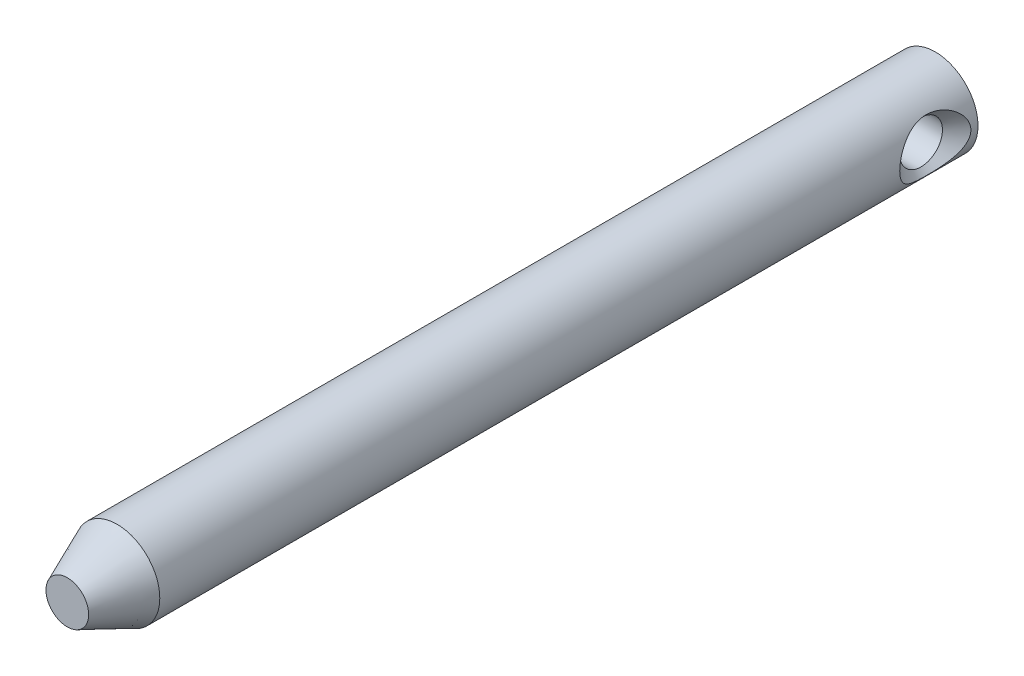
ISO-10303-21;
HEADER;
FILE_DESCRIPTION(('STEP AP214'),'2;1');
FILE_NAME('part.step','',(''),(''),'','','');
FILE_SCHEMA(('AUTOMOTIVE_DESIGN { 1 0 10303 214 1 1 1 1 }'));
ENDSEC;
DATA;
#1=APPLICATION_CONTEXT('core data for automotive mechanical design processes');
#2=APPLICATION_PROTOCOL_DEFINITION('international standard','automotive_design',2000,#1);
#3=PRODUCT_CONTEXT('',#1,'mechanical');
#4=PRODUCT('Part','Part','',(#3));
#5=PRODUCT_RELATED_PRODUCT_CATEGORY('part','',(#4));
#6=PRODUCT_DEFINITION_FORMATION('','',#4);
#7=PRODUCT_DEFINITION_CONTEXT('part definition',#1,'design');
#8=PRODUCT_DEFINITION('design','',#6,#7);
#9=PRODUCT_DEFINITION_SHAPE('','',#8);
#10=(LENGTH_UNIT() NAMED_UNIT(*) SI_UNIT(.MILLI.,.METRE.));
#11=(NAMED_UNIT(*) PLANE_ANGLE_UNIT() SI_UNIT($,.RADIAN.));
#12=(NAMED_UNIT(*) SI_UNIT($,.STERADIAN.) SOLID_ANGLE_UNIT());
#13=UNCERTAINTY_MEASURE_WITH_UNIT(LENGTH_MEASURE(1.E-05),#10,'distance_accuracy_value','');
#14=(GEOMETRIC_REPRESENTATION_CONTEXT(3) GLOBAL_UNCERTAINTY_ASSIGNED_CONTEXT((#13)) GLOBAL_UNIT_ASSIGNED_CONTEXT((#10,
#11,#12)) REPRESENTATION_CONTEXT('',''));
#15=CARTESIAN_POINT('',(0.,0.,0.));
#16=DIRECTION('',(0.,0.,1.));
#17=DIRECTION('',(1.,0.,0.));
#18=AXIS2_PLACEMENT_3D('',#15,#16,#17);
#19=CARTESIAN_POINT('',(0.,0.,58.));
#20=DIRECTION('',(0.,0.,-1.));
#21=DIRECTION('',(-1.,0.,0.));
#22=AXIS2_PLACEMENT_3D('',#19,#20,#21);
#23=CYLINDRICAL_SURFACE('',#22,3.);
#24=CARTESIAN_POINT('',(2.66386083810834,-1.37979915322012,-1.66686764623428));
#25=CARTESIAN_POINT('',(2.62048312473104,-1.46355103999937,-1.54123815708051));
#26=CARTESIAN_POINT('',(2.57806476691628,-1.5358503604868,-1.40759021079523));
#27=CARTESIAN_POINT('',(2.50076824693584,-1.65874746247969,-1.12843490273824));
#28=CARTESIAN_POINT('',(2.46590094989423,-1.70931407465507,-0.982910861436584));
#29=CARTESIAN_POINT('',(2.42302162115432,-1.76905556485402,-0.757867086227455));
#30=CARTESIAN_POINT('',(2.41025760475463,-1.78633151510865,-0.681311984933327));
#31=CARTESIAN_POINT('',(2.38852855351107,-1.81528637208653,-0.526630429820961));
#32=CARTESIAN_POINT('',(2.37956194247084,-1.82696760128551,-0.448504642082999));
#33=CARTESIAN_POINT('',(2.36587045936589,-1.84466300659937,-0.291355187672745));
#34=CARTESIAN_POINT('',(2.36113978247728,-1.85068493864389,-0.212332900490256));
#35=CARTESIAN_POINT('',(2.35613962528211,-1.85704684677878,-0.0539211189321968));
#36=CARTESIAN_POINT('',(2.35586985881725,-1.85738718733168,0.0254683515625119));
#37=CARTESIAN_POINT('',(2.35970407982159,-1.85251340945212,0.17982275715913));
#38=CARTESIAN_POINT('',(2.36358074345783,-1.84758798756759,0.254802552351797));
#39=CARTESIAN_POINT('',(2.37516756149281,-1.83266533269475,0.403964777149451));
#40=CARTESIAN_POINT('',(2.38287910949159,-1.8226662559093,0.478146906862831));
#41=CARTESIAN_POINT('',(2.41131657573291,-1.78510001614048,0.698874071525874));
#42=CARTESIAN_POINT('',(2.43734345368479,-1.74996572410296,0.843541214945382));
#43=CARTESIAN_POINT('',(2.49995274431067,-1.65930194215084,1.1260277382481));
#44=CARTESIAN_POINT('',(2.53667337026131,-1.60350261835601,1.2637278086226));
#45=CARTESIAN_POINT('',(2.61566887459633,-1.47113059141619,1.52707436676218));
#46=CARTESIAN_POINT('',(2.65793923094475,-1.39457474759849,1.65273052547482));
#47=CARTESIAN_POINT('',(2.73113168566424,-1.24334649809494,1.85537253789389));
#48=CARTESIAN_POINT('',(2.76199646258372,-1.17388264145057,1.93627180101488));
#49=CARTESIAN_POINT('',(2.82148203077056,-1.0226528075613,2.08660120572884));
#50=CARTESIAN_POINT('',(2.85010688305726,-0.940909917100548,2.156052368463));
#51=CARTESIAN_POINT('',(2.89591477203782,-0.786439883738147,2.26453920739955));
#52=CARTESIAN_POINT('',(2.91418695857295,-0.716360429298989,2.30686354705756));
#53=CARTESIAN_POINT('',(2.94637498511411,-0.56964646355719,2.38048631185397));
#54=CARTESIAN_POINT('',(2.96029389234485,-0.493016616209619,2.41179250209521));
#55=CARTESIAN_POINT('',(2.98245038076774,-0.333899827207412,2.4612897469545));
#56=CARTESIAN_POINT('',(2.99063028288931,-0.25136236000655,2.47934773258456));
#57=CARTESIAN_POINT('',(2.99999015036128,-0.0839984661640063,2.49999212993475));
#58=CARTESIAN_POINT('',(3.00117716255189,0.000825569619126084,2.50259411691883));
#59=CARTESIAN_POINT('',(2.99676906584425,0.156625638658305,2.49288670930779));
#60=CARTESIAN_POINT('',(2.99216044748533,0.22777773223735,2.48274641771348));
#61=CARTESIAN_POINT('',(2.97825969713767,0.367271258424914,2.45192612626688));
#62=CARTESIAN_POINT('',(2.96896553796903,0.435611460626318,2.4312415644363));
#63=CARTESIAN_POINT('',(2.94357928317584,0.585229409645112,2.37410007747839));
#64=CARTESIAN_POINT('',(2.92635043864886,0.665278796584185,2.33494681174553));
#65=CARTESIAN_POINT('',(2.88758029918445,0.817357195237142,2.24497892582091));
#66=CARTESIAN_POINT('',(2.86603156414505,0.889372031386839,2.19414416430819));
#67=CARTESIAN_POINT('',(2.81151026341713,1.05132125667217,2.06193155523983));
#68=CARTESIAN_POINT('',(2.77734412750359,1.13740406109526,1.97634720537604));
#69=CARTESIAN_POINT('',(2.70784889639362,1.2941916209877,1.79251191091511));
#70=CARTESIAN_POINT('',(2.67251752686869,1.36486396851342,1.69423495160586));
#71=CARTESIAN_POINT('',(2.59470531753389,1.50858879837928,1.46066928908898));
#72=CARTESIAN_POINT('',(2.55282371235301,1.57727061637557,1.32249057274065));
#73=CARTESIAN_POINT('',(2.47802506921578,1.69237164712083,1.03487689819777));
#74=CARTESIAN_POINT('',(2.44510671896577,1.7387941195778,0.885443591861208));
#75=CARTESIAN_POINT('',(2.40628940136714,1.79171175259569,0.655565817942985));
#76=CARTESIAN_POINT('',(2.39510000721253,1.80657628542867,0.577843548044562));
#77=CARTESIAN_POINT('',(2.37677408136336,1.83062286793572,0.421064089129516));
#78=CARTESIAN_POINT('',(2.36963580224647,1.83980736780894,0.34200749084296));
#79=CARTESIAN_POINT('',(2.35977805749109,1.85243375985462,0.183238352368714));
#80=CARTESIAN_POINT('',(2.35705451948371,1.85588094448046,0.103526484945142));
#81=CARTESIAN_POINT('',(2.35615461448305,1.8570235336348,-0.0559616968592107));
#82=CARTESIAN_POINT('',(2.35797799687534,1.854719255169,-0.135738007445773));
#83=CARTESIAN_POINT('',(2.36581282034486,1.84471321175201,-0.289519747378977));
#84=CARTESIAN_POINT('',(2.37154431154019,1.83737204767886,-0.363563205934554));
#85=CARTESIAN_POINT('',(2.38663601929453,1.81772301785787,-0.510621824512316));
#86=CARTESIAN_POINT('',(2.3959975367598,1.80541337147145,-0.583636606151023));
#87=CARTESIAN_POINT('',(2.42899764160143,1.76106904016169,-0.800591947683967));
#88=CARTESIAN_POINT('',(2.45754684221219,1.72162440278496,-0.942360172781471));
#89=CARTESIAN_POINT('',(2.52470927590775,1.62159661810973,-1.22126320179982));
#90=CARTESIAN_POINT('',(2.5636296990919,1.56034486627483,-1.35808006052695));
#91=CARTESIAN_POINT('',(2.64591858979961,1.41633224097433,-1.61844312870144));
#92=CARTESIAN_POINT('',(2.68928092226151,1.33360079857623,-1.74200717207382));
#93=CARTESIAN_POINT('',(2.76102027620898,1.1754498594614,-1.93385111436272));
#94=CARTESIAN_POINT('',(2.78973170097249,1.10623566815403,-2.00713048549015));
#95=CARTESIAN_POINT('',(2.84446666710867,0.956725507388998,-2.14256658707483));
#96=CARTESIAN_POINT('',(2.87049488534927,0.876449410096681,-2.20474281394356));
#97=CARTESIAN_POINT('',(2.91216614313698,0.723931716908718,-2.30226358153356));
#98=CARTESIAN_POINT('',(2.9288331405413,0.653833356122699,-2.34050122063294));
#99=CARTESIAN_POINT('',(2.95765501528389,0.507741960294745,-2.40591946250966));
#100=CARTESIAN_POINT('',(2.96981324499264,0.43175335581398,-2.43310828178085));
#101=CARTESIAN_POINT('',(2.98843330532246,0.274857044278334,-2.47452973713646));
#102=CARTESIAN_POINT('',(2.99484495953196,0.19391247700665,-2.48864828415274));
#103=CARTESIAN_POINT('',(3.00095440798421,0.0305646287071134,-2.50210530307074));
#104=CARTESIAN_POINT('',(3.00065695370539,-0.0518375786765533,-2.50145423500527));
#105=CARTESIAN_POINT('',(2.99389673167901,-0.203969979729621,-2.48655572121436));
#106=CARTESIAN_POINT('',(2.98826006595983,-0.273926672903789,-2.47412999287849));
#107=CARTESIAN_POINT('',(2.97254740725347,-0.410744250843805,-2.43920253378341));
#108=CARTESIAN_POINT('',(2.96246912547902,-0.477603519835371,-2.41669560803417));
#109=CARTESIAN_POINT('',(2.93504356972724,-0.626819115734012,-2.3547116711019));
#110=CARTESIAN_POINT('',(2.91641547826712,-0.707652576484454,-2.31214870358371));
#111=CARTESIAN_POINT('',(2.8749755412095,-0.860719240991078,-2.21528300015838));
#112=CARTESIAN_POINT('',(2.85215714324337,-0.932938679150409,-2.16096185391293));
#113=CARTESIAN_POINT('',(2.80227037578114,-1.07391996470912,-2.03859295395376));
#114=CARTESIAN_POINT('',(2.77500873564044,-1.14195949084878,-1.96980035360251));
#115=CARTESIAN_POINT('',(2.71965486186845,-1.26815917162192,-1.82405374200271));
#116=CARTESIAN_POINT('',(2.69156222722551,-1.32631446201961,-1.74709574247739));
#117=CARTESIAN_POINT('',(2.66386083810834,-1.37979915322012,-1.66686764623428));
#118=B_SPLINE_CURVE_WITH_KNOTS('',3,(#24,#25,#26,#27,#28,#29,#30,#31,#32,#33,#34,#35,#36,#37,
#38,#39,#40,#41,#42,#43,#44,#45,#46,#47,#48,#49,#50,#51,#52,#53,#54,#55,#56,#57,#58,#59,#60,#61,
#62,#63,#64,#65,#66,#67,#68,#69,#70,#71,#72,#73,#74,#75,#76,#77,#78,#79,#80,#81,#82,#83,#84,#85,
#86,#87,#88,#89,#90,#91,#92,#93,#94,#95,#96,#97,#98,#99,#100,#101,#102,#103,#104,#105,#106,#107,
#108,#109,#110,#111,#112,#113,#114,#115,#116,#117),.UNSPECIFIED.,.T.,.F.,(4,2,2,2,2,2,2,2,2,2,2,
2,2,2,2,2,2,2,2,2,2,2,2,2,2,2,2,2,2,2,2,2,2,2,2,2,2,2,2,2,2,2,2,2,2,2,4),(0.,0.470927220206849,
0.942527614508429,1.1808082877225,1.4189899601538,1.6568447323029,1.89468424649388,
2.1201222783769,2.34564229455327,2.79685627961222,3.25418258256505,3.71113853275211,
4.04314994198313,4.37454474777687,4.62528471713935,4.87584762056761,5.12889403054833,
5.38168539818342,5.59672011114191,5.81184793792523,6.08264456153781,6.35391164535695,
6.73016527113545,7.10720268017236,7.58456723012406,8.06186185238435,8.30135272660423,
8.54074021931294,8.77990676359495,9.01906012592977,9.2426673157726,9.46635471474252,
9.91397743791621,10.3767100865799,10.8388120233189,11.1522999773392,11.4652319346728,
11.7090276523582,11.9526417372554,12.1983627891093,12.4439098235663,12.6567655342614,
12.8697310590689,13.14790197869,13.4265116355624,13.7271023972825,14.0278406602552),.UNSPECIFIED.);
#119=CARTESIAN_POINT('',(2.66386083810834,-1.37979915322012,-1.66686764623428));
#120=VERTEX_POINT('',#119);
#121=EDGE_CURVE('E10',#120,#120,#118,.T.);
#122=ORIENTED_EDGE('',*,*,#121,.T.);
#123=EDGE_LOOP('',(#122));
#124=FACE_BOUND('',#123,.T.);
#125=CARTESIAN_POINT('',(-2.66386083810834,-1.37979915322012,-1.66686764623428));
#126=CARTESIAN_POINT('',(-2.69334892677236,-1.32287351062045,-1.75227285621621));
#127=CARTESIAN_POINT('',(-2.72331282463489,-1.2605757756372,-1.83405648603397));
#128=CARTESIAN_POINT('',(-2.78220473396186,-1.12464463885518,-1.98830038522765));
#129=CARTESIAN_POINT('',(-2.81113167084641,-1.05099987439992,-2.06075117389502));
#130=CARTESIAN_POINT('',(-2.86070417073024,-0.906167181305939,-2.18140205362808));
#131=CARTESIAN_POINT('',(-2.88190770172497,-0.836870519646595,-2.23162354530737));
#132=CARTESIAN_POINT('',(-2.92039632839413,-0.690633332248034,-2.32127180252191));
#133=CARTESIAN_POINT('',(-2.9376878238515,-0.613705591366831,-2.36071622078436));
#134=CARTESIAN_POINT('',(-2.96436739033889,-0.466069004783613,-2.42095891401919));
#135=CARTESIAN_POINT('',(-2.97457535376915,-0.396319161374572,-2.44372573200574));
#136=CARTESIAN_POINT('',(-2.99012032730513,-0.253608106040217,-2.47824519107923));
#137=CARTESIAN_POINT('',(-2.99546056262944,-0.180649054091419,-2.49000512515403));
#138=CARTESIAN_POINT('',(-3.00072232435431,-0.0333388412005374,-2.50159308228288));
#139=CARTESIAN_POINT('',(-3.00062633848452,0.0410160473279502,-2.50138254358712));
#140=CARTESIAN_POINT('',(-2.99498221214762,0.188501078613342,-2.48895078017302));
#141=CARTESIAN_POINT('',(-2.98943269680772,0.261630907795796,-2.47672652671336));
#142=CARTESIAN_POINT('',(-2.97383375771635,0.401289073810237,-2.44207022482902));
#143=CARTESIAN_POINT('',(-2.96400095103303,0.467966377015368,-2.42012880314283));
#144=CARTESIAN_POINT('',(-2.94071422522027,0.597086999199795,-2.36755250118829));
#145=CARTESIAN_POINT('',(-2.92725885843618,0.659528612988044,-2.33691414516723));
#146=CARTESIAN_POINT('',(-2.89034379908427,0.808945031473909,-2.25154647388905));
#147=CARTESIAN_POINT('',(-2.86521115508198,0.892965770677258,-2.19236612601183));
#148=CARTESIAN_POINT('',(-2.81157099234214,1.04975001487678,-2.06182555302208));
#149=CARTESIAN_POINT('',(-2.78305480728584,1.12248346118702,-1.99043383506557));
#150=CARTESIAN_POINT('',(-2.7137365592192,1.28294520423525,-1.80909937484199));
#151=CARTESIAN_POINT('',(-2.67243577378325,1.36564640952818,-1.69490422015195));
#152=CARTESIAN_POINT('',(-2.59276586034668,1.5114444370925,-1.45379286307165));
#153=CARTESIAN_POINT('',(-2.55439993094401,1.57452009341635,-1.32686312025624));
#154=CARTESIAN_POINT('',(-2.48425817067878,1.68307519993907,-1.06036085070104));
#155=CARTESIAN_POINT('',(-2.45264788914948,1.7281320898612,-0.920569922475952));
#156=CARTESIAN_POINT('',(-2.41429691350804,1.78090650233528,-0.705823596180948));
#157=CARTESIAN_POINT('',(-2.40302435614363,1.79602907381235,-0.633402168448798));
#158=CARTESIAN_POINT('',(-2.38392563039164,1.82130555610122,-0.487258521528712));
#159=CARTESIAN_POINT('',(-2.37609809974485,1.83146143105965,-0.413536828517434));
#160=CARTESIAN_POINT('',(-2.36394039823033,1.8471300540647,-0.26164153151307));
#161=CARTESIAN_POINT('',(-2.35980011253159,1.852391274005,-0.183426608316477));
#162=CARTESIAN_POINT('',(-2.35589418332746,1.85735633347034,-0.0267085603680695));
#163=CARTESIAN_POINT('',(-2.35612867583215,1.85706000021331,0.0517945732682298));
#164=CARTESIAN_POINT('',(-2.36096319687412,1.85091036974158,0.208450937066319));
#165=CARTESIAN_POINT('',(-2.36556325460953,1.84505703536007,0.286604164884327));
#166=CARTESIAN_POINT('',(-2.37888911997166,1.82783986860542,0.441923060508806));
#167=CARTESIAN_POINT('',(-2.38761487998973,1.81647609982004,0.519088739700567));
#168=CARTESIAN_POINT('',(-2.41818009217668,1.77582322921009,0.739503942970059));
#169=CARTESIAN_POINT('',(-2.44479368912929,1.73956800793155,0.880883341426866));
#170=CARTESIAN_POINT('',(-2.50751133617451,1.64786092833372,1.15529951732676));
#171=CARTESIAN_POINT('',(-2.54363667204606,1.59236592505261,1.28831674394154));
#172=CARTESIAN_POINT('',(-2.624029377603,1.45644894661184,1.55321435069159));
#173=CARTESIAN_POINT('',(-2.66871986311665,1.37436759368882,1.68412364681854));
#174=CARTESIAN_POINT('',(-2.75771290404722,1.18567690466578,1.92689839126828));
#175=CARTESIAN_POINT('',(-2.80201630129466,1.07917512392869,2.03884371039169));
#176=CARTESIAN_POINT('',(-2.86412724783158,0.895210119797023,2.18956052343536));
#177=CARTESIAN_POINT('',(-2.88475969265489,0.826869743613901,2.23832817454426));
#178=CARTESIAN_POINT('',(-2.92220754280464,0.682809542946967,2.32542055584954));
#179=CARTESIAN_POINT('',(-2.93902591448788,0.60709551921291,2.36375340628788));
#180=CARTESIAN_POINT('',(-2.96739891451816,0.448435714936741,2.42778695987106));
#181=CARTESIAN_POINT('',(-2.97889218774367,0.36541815044364,2.45334067729406));
#182=CARTESIAN_POINT('',(-2.99483656026796,0.195442770069915,2.48866425751242));
#183=CARTESIAN_POINT('',(-2.99929748705284,0.108490627880355,2.49845614737768));
#184=CARTESIAN_POINT('',(-3.00045548454966,-0.0525649145047446,2.50100063612137));
#185=CARTESIAN_POINT('',(-2.99821956154096,-0.126633419092965,2.49609495326433));
#186=CARTESIAN_POINT('',(-2.98847761141492,-0.272687204431191,2.47458827287936));
#187=CARTESIAN_POINT('',(-2.98097039934664,-0.344672012991034,2.45798464572803));
#188=CARTESIAN_POINT('',(-2.96174031048842,-0.482487901846585,2.41502267031089));
#189=CARTESIAN_POINT('',(-2.95015695894938,-0.548441148299762,2.38898641850023));
#190=CARTESIAN_POINT('',(-2.92364864410435,-0.675653514068204,2.32859488110978));
#191=CARTESIAN_POINT('',(-2.908722497107,-0.73691096025097,2.29423664834574));
#192=CARTESIAN_POINT('',(-2.86745976042433,-0.886931829875541,2.19758664031368));
#193=CARTESIAN_POINT('',(-2.83939202552518,-0.972060688768636,2.13038290797154));
#194=CARTESIAN_POINT('',(-2.78041138605713,-1.12979796269503,1.98359011366781));
#195=CARTESIAN_POINT('',(-2.74949060105446,-1.20237000455217,1.90396630080768));
#196=CARTESIAN_POINT('',(-2.67614483205046,-1.35950132299906,1.7049722752559));
#197=CARTESIAN_POINT('',(-2.63358950034453,-1.43895633842408,1.58161886803558));
#198=CARTESIAN_POINT('',(-2.55328373792295,-1.57705858087565,1.32244063004427));
#199=CARTESIAN_POINT('',(-2.51553695016676,-1.63569009140623,1.18660647636724));
#200=CARTESIAN_POINT('',(-2.44921365439295,-1.73347198963115,0.90336863277509));
#201=CARTESIAN_POINT('',(-2.4207865666004,-1.772310016646,0.755819526328857));
#202=CARTESIAN_POINT('',(-2.38900404582614,-1.814648370123,0.530234624043009));
#203=CARTESIAN_POINT('',(-2.38022066385817,-1.82610688486436,0.454355126676118));
#204=CARTESIAN_POINT('',(-2.36662999554068,-1.84368995120376,0.301608527798366));
#205=CARTESIAN_POINT('',(-2.36182251992092,-1.84981475671001,0.224741473476386));
#206=CARTESIAN_POINT('',(-2.35643428873916,-1.85667316246375,0.0708613721363315));
#207=CARTESIAN_POINT('',(-2.3558404897236,-1.85742339977843,-0.00615048556616273));
#208=CARTESIAN_POINT('',(-2.35887136981205,-1.85357270421873,-0.159958260413978));
#209=CARTESIAN_POINT('',(-2.36249615613959,-1.84897163533055,-0.236754172020877));
#210=CARTESIAN_POINT('',(-2.37379804946587,-1.83443944670417,-0.389646021829488));
#211=CARTESIAN_POINT('',(-2.38148072926006,-1.82450099670617,-0.465740850637884));
#212=CARTESIAN_POINT('',(-2.40054253119794,-1.79934413459528,-0.616592929677338));
#213=CARTESIAN_POINT('',(-2.4119230294334,-1.78412375674264,-0.691349671013715));
#214=CARTESIAN_POINT('',(-2.45011441907724,-1.7317050994264,-0.908401787283766));
#215=CARTESIAN_POINT('',(-2.48138286808336,-1.68728653747692,-1.0482362183169));
#216=CARTESIAN_POINT('',(-2.55167960423884,-1.57894711467936,-1.31762737838866));
#217=CARTESIAN_POINT('',(-2.59068536127366,-1.5150825958394,-1.44721245480658));
#218=CARTESIAN_POINT('',(-2.6419796346963,-1.42142324214115,-1.60280159034319));
#219=CARTESIAN_POINT('',(-2.65288729032535,-1.40098317319044,-1.6350853844766));
#220=CARTESIAN_POINT('',(-2.66386083810834,-1.37979915322012,-1.66686764623428));
#221=B_SPLINE_CURVE_WITH_KNOTS('',3,(#125,#126,#127,#128,#129,#130,#131,#132,#133,#134,#135,
#136,#137,#138,#139,#140,#141,#142,#143,#144,#145,#146,#147,#148,#149,#150,#151,#152,#153,#154,
#155,#156,#157,#158,#159,#160,#161,#162,#163,#164,#165,#166,#167,#168,#169,#170,#171,#172,#173,
#174,#175,#176,#177,#178,#179,#180,#181,#182,#183,#184,#185,#186,#187,#188,#189,#190,#191,#192,
#193,#194,#195,#196,#197,#198,#199,#200,#201,#202,#203,#204,#205,#206,#207,#208,#209,#210,#211,
#212,#213,#214,#215,#216,#217,#218,#219,#220),.UNSPECIFIED.,.T.,.F.,(4,2,2,2,2,2,2,2,2,2,2,2,2,
2,2,2,2,2,2,2,2,2,2,2,2,2,2,2,2,2,2,2,2,2,2,2,2,2,2,2,2,2,2,2,2,2,2,4),(0.,0.320305906063788,
0.640934669132557,0.904556013297868,1.16774292399038,1.38903992004592,1.61019018418197,
1.83205290328953,2.05397156988862,2.26577598507892,2.47766516792944,2.79328227898365,
3.10972598255756,3.54814849376714,3.98704221308414,4.43569740893557,4.66000104662593,
4.88421590856492,5.11940260883343,5.35459662097305,5.58979220616797,5.82498507738352,
6.26804384132136,6.71210265495175,7.19225283273772,7.67032756999606,7.92887113110369,
8.18721291765476,8.44846148125687,8.709344633421,8.93098164826346,9.15266850159868,
9.36740613884639,9.58221993573821,9.91642261525406,10.2515777326282,10.7075078880694,
11.1637814281889,11.6270482723301,11.8585293542176,12.089999415977,12.3207526473844,
12.5515117439604,12.7825885742877,13.0137514953235,13.4618657111953,13.9086937363181,
14.0278907519475),.UNSPECIFIED.);
#222=CARTESIAN_POINT('',(-2.66386083810834,-1.37979915322012,-1.66686764623428));
#223=VERTEX_POINT('',#222);
#224=EDGE_CURVE('E41',#223,#223,#221,.T.);
#225=ORIENTED_EDGE('',*,*,#224,.T.);
#226=EDGE_LOOP('',(#225));
#227=FACE_BOUND('',#226,.T.);
#228=CARTESIAN_POINT('',(0.,0.,54.5000000000001));
#229=DIRECTION('',(0.,0.,1.));
#230=DIRECTION('',(1.,0.,0.));
#231=AXIS2_PLACEMENT_3D('',#228,#229,#230);
#232=CIRCLE('',#231,3.);
#233=CARTESIAN_POINT('',(3.,0.,54.5000000000001));
#234=VERTEX_POINT('',#233);
#235=EDGE_CURVE('E45',#234,#234,#232,.F.);
#236=ORIENTED_EDGE('',*,*,#235,.T.);
#237=EDGE_LOOP('',(#236));
#238=FACE_BOUND('',#237,.T.);
#239=CARTESIAN_POINT('',(0.,0.,-3.));
#240=DIRECTION('',(0.,0.,1.));
#241=DIRECTION('',(1.,0.,0.));
#242=AXIS2_PLACEMENT_3D('',#239,#240,#241);
#243=CIRCLE('',#242,3.);
#244=CARTESIAN_POINT('',(3.,0.,-3.));
#245=VERTEX_POINT('',#244);
#246=EDGE_CURVE('E89',#245,#245,#243,.T.);
#247=ORIENTED_EDGE('',*,*,#246,.T.);
#248=EDGE_LOOP('',(#247));
#249=FACE_BOUND('',#248,.T.);
#250=ADVANCED_FACE('F30',(#124,#227,#238,#249),#23,.T.);
#251=CARTESIAN_POINT('',(0.,0.,58.));
#252=DIRECTION('',(0.,0.,1.));
#253=DIRECTION('',(1.,0.,0.));
#254=AXIS2_PLACEMENT_3D('',#251,#252,#253);
#255=PLANE('',#254);
#256=CARTESIAN_POINT('',(0.,0.,58.));
#257=DIRECTION('',(0.,0.,1.));
#258=DIRECTION('',(1.,0.,0.));
#259=AXIS2_PLACEMENT_3D('',#256,#257,#258);
#260=CIRCLE('',#259,1.50000000000004);
#261=CARTESIAN_POINT('',(1.50000000000004,0.,58.));
#262=VERTEX_POINT('',#261);
#263=EDGE_CURVE('E49',#262,#262,#260,.T.);
#264=ORIENTED_EDGE('',*,*,#263,.T.);
#265=EDGE_LOOP('',(#264));
#266=FACE_BOUND('',#265,.T.);
#267=ADVANCED_FACE('F71',(#266),#255,.T.);
#268=CARTESIAN_POINT('',(0.,0.,-3.));
#269=DIRECTION('',(0.,0.,1.));
#270=DIRECTION('',(1.,0.,0.));
#271=AXIS2_PLACEMENT_3D('',#268,#269,#270);
#272=PLANE('',#271);
#273=ORIENTED_EDGE('',*,*,#246,.F.);
#274=EDGE_LOOP('',(#273));
#275=FACE_BOUND('',#274,.T.);
#276=ADVANCED_FACE('F73',(#275),#272,.F.);
#277=CARTESIAN_POINT('',(0.,0.,58.));
#278=DIRECTION('',(0.,0.,-1.));
#279=DIRECTION('',(-1.,0.,0.));
#280=AXIS2_PLACEMENT_3D('',#277,#278,#279);
#281=CONICAL_SURFACE('',#280,1.50000000000004,0.404891786285081);
#282=ORIENTED_EDGE('',*,*,#235,.F.);
#283=EDGE_LOOP('',(#282));
#284=FACE_BOUND('',#283,.T.);
#285=ORIENTED_EDGE('',*,*,#263,.F.);
#286=EDGE_LOOP('',(#285));
#287=FACE_BOUND('',#286,.T.);
#288=ADVANCED_FACE('F32',(#284,#287),#281,.T.);
#289=CARTESIAN_POINT('',(3.,0.,0.));
#290=DIRECTION('',(1.,0.,0.));
#291=DIRECTION('',(0.,0.,-1.));
#292=AXIS2_PLACEMENT_3D('',#289,#290,#291);
#293=CONICAL_SURFACE('',#292,2.49999999999999,0.785398163397443);
#294=CARTESIAN_POINT('',(2.,0.,0.));
#295=DIRECTION('',(1.,0.,0.));
#296=DIRECTION('',(0.,0.,-1.));
#297=AXIS2_PLACEMENT_3D('',#294,#295,#296);
#298=CIRCLE('',#297,1.5);
#299=CARTESIAN_POINT('',(2.,0.,-1.5));
#300=VERTEX_POINT('',#299);
#301=EDGE_CURVE('E90',#300,#300,#298,.T.);
#302=ORIENTED_EDGE('',*,*,#301,.F.);
#303=EDGE_LOOP('',(#302));
#304=FACE_BOUND('',#303,.T.);
#305=ORIENTED_EDGE('',*,*,#121,.F.);
#306=EDGE_LOOP('',(#305));
#307=FACE_BOUND('',#306,.T.);
#308=ADVANCED_FACE('F63',(#304,#307),#293,.F.);
#309=CARTESIAN_POINT('',(-2.,0.,0.));
#310=DIRECTION('',(-1.,0.,0.));
#311=DIRECTION('',(0.,0.,1.));
#312=AXIS2_PLACEMENT_3D('',#309,#310,#311);
#313=CONICAL_SURFACE('',#312,1.5,0.785398163397443);
#314=CARTESIAN_POINT('',(-2.,0.,0.));
#315=DIRECTION('',(1.,0.,0.));
#316=DIRECTION('',(0.,0.,-1.));
#317=AXIS2_PLACEMENT_3D('',#314,#315,#316);
#318=CIRCLE('',#317,1.5);
#319=CARTESIAN_POINT('',(-2.,0.,-1.5));
#320=VERTEX_POINT('',#319);
#321=EDGE_CURVE('E94',#320,#320,#318,.T.);
#322=ORIENTED_EDGE('',*,*,#321,.T.);
#323=EDGE_LOOP('',(#322));
#324=FACE_BOUND('',#323,.T.);
#325=ORIENTED_EDGE('',*,*,#224,.F.);
#326=EDGE_LOOP('',(#325));
#327=FACE_BOUND('',#326,.T.);
#328=ADVANCED_FACE('F58',(#324,#327),#313,.F.);
#329=CARTESIAN_POINT('',(-3.,0.,0.));
#330=DIRECTION('',(1.,0.,0.));
#331=DIRECTION('',(0.,0.,-1.));
#332=AXIS2_PLACEMENT_3D('',#329,#330,#331);
#333=CYLINDRICAL_SURFACE('',#332,1.5);
#334=ORIENTED_EDGE('',*,*,#321,.F.);
#335=EDGE_LOOP('',(#334));
#336=FACE_BOUND('',#335,.T.);
#337=ORIENTED_EDGE('',*,*,#301,.T.);
#338=EDGE_LOOP('',(#337));
#339=FACE_BOUND('',#338,.T.);
#340=ADVANCED_FACE('F62',(#336,#339),#333,.F.);
#341=CLOSED_SHELL('',(#250,#267,#276,#288,#308,#328,#340));
#342=MANIFOLD_SOLID_BREP('B2',#341);
#343=ADVANCED_BREP_SHAPE_REPRESENTATION('',(#18,#342),#14);
#344=SHAPE_DEFINITION_REPRESENTATION(#9,#343);
ENDSEC;
END-ISO-10303-21;
